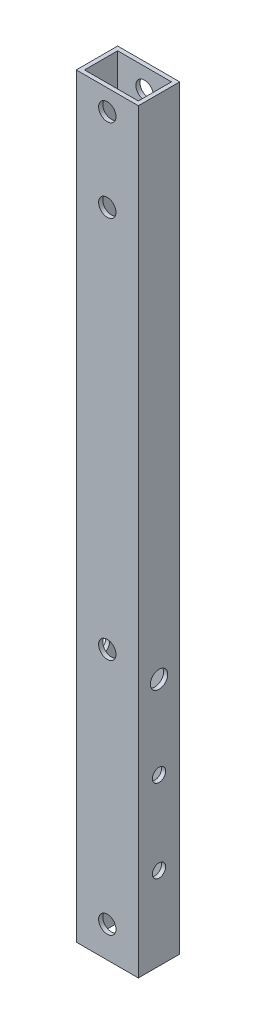
ISO-10303-21;
HEADER;
FILE_DESCRIPTION(('STEP AP214'),'2;1');
FILE_NAME('part.step','',(''),(''),'','','');
FILE_SCHEMA(('AUTOMOTIVE_DESIGN { 1 0 10303 214 1 1 1 1 }'));
ENDSEC;
DATA;
#1=APPLICATION_CONTEXT('core data for automotive mechanical design processes');
#2=APPLICATION_PROTOCOL_DEFINITION('international standard','automotive_design',2000,#1);
#3=PRODUCT_CONTEXT('',#1,'mechanical');
#4=PRODUCT('Part','Part','',(#3));
#5=PRODUCT_RELATED_PRODUCT_CATEGORY('part','',(#4));
#6=PRODUCT_DEFINITION_FORMATION('','',#4);
#7=PRODUCT_DEFINITION_CONTEXT('part definition',#1,'design');
#8=PRODUCT_DEFINITION('design','',#6,#7);
#9=PRODUCT_DEFINITION_SHAPE('','',#8);
#10=(LENGTH_UNIT() NAMED_UNIT(*) SI_UNIT(.MILLI.,.METRE.));
#11=(NAMED_UNIT(*) PLANE_ANGLE_UNIT() SI_UNIT($,.RADIAN.));
#12=(NAMED_UNIT(*) SI_UNIT($,.STERADIAN.) SOLID_ANGLE_UNIT());
#13=UNCERTAINTY_MEASURE_WITH_UNIT(LENGTH_MEASURE(1.E-05),#10,'distance_accuracy_value','');
#14=(GEOMETRIC_REPRESENTATION_CONTEXT(3) GLOBAL_UNCERTAINTY_ASSIGNED_CONTEXT((#13)) GLOBAL_UNIT_ASSIGNED_CONTEXT((#10,
#11,#12)) REPRESENTATION_CONTEXT('',''));
#15=CARTESIAN_POINT('',(0.,0.,0.));
#16=DIRECTION('',(0.,0.,1.));
#17=DIRECTION('',(1.,0.,0.));
#18=AXIS2_PLACEMENT_3D('',#15,#16,#17);
#19=CARTESIAN_POINT('',(0.,182.5,0.));
#20=DIRECTION('',(0.,1.,0.));
#21=DIRECTION('',(0.,0.,1.));
#22=AXIS2_PLACEMENT_3D('',#19,#20,#21);
#23=PLANE('',#22);
#24=DIRECTION('',(0.,0.,-1.));
#25=VECTOR('',#24,1.);
#26=CARTESIAN_POINT('',(7.50000000000001,182.5,-5.));
#27=LINE('',#26,#25);
#28=CARTESIAN_POINT('',(7.50000000000001,182.5,5.));
#29=VERTEX_POINT('',#28);
#30=CARTESIAN_POINT('',(7.50000000000001,182.5,-5.));
#31=VERTEX_POINT('',#30);
#32=EDGE_CURVE('E164',#29,#31,#27,.T.);
#33=ORIENTED_EDGE('',*,*,#32,.T.);
#34=DIRECTION('',(-1.,0.,0.));
#35=VECTOR('',#34,1.);
#36=CARTESIAN_POINT('',(-7.49999999999999,182.5,-5.));
#37=LINE('',#36,#35);
#38=CARTESIAN_POINT('',(-7.49999999999999,182.5,-5.));
#39=VERTEX_POINT('',#38);
#40=EDGE_CURVE('E167',#31,#39,#37,.T.);
#41=ORIENTED_EDGE('',*,*,#40,.T.);
#42=DIRECTION('',(0.,0.,1.));
#43=VECTOR('',#42,1.);
#44=CARTESIAN_POINT('',(-7.49999999999999,182.5,-5.));
#45=LINE('',#44,#43);
#46=CARTESIAN_POINT('',(-7.49999999999999,182.5,5.));
#47=VERTEX_POINT('',#46);
#48=EDGE_CURVE('E170',#39,#47,#45,.T.);
#49=ORIENTED_EDGE('',*,*,#48,.T.);
#50=DIRECTION('',(1.,0.,0.));
#51=VECTOR('',#50,1.);
#52=CARTESIAN_POINT('',(-7.49999999999999,182.5,5.));
#53=LINE('',#52,#51);
#54=EDGE_CURVE('E172',#47,#29,#53,.T.);
#55=ORIENTED_EDGE('',*,*,#54,.T.);
#56=EDGE_LOOP('',(#33,#41,#49,#55));
#57=FACE_BOUND('',#56,.T.);
#58=DIRECTION('',(-1.,0.,0.));
#59=VECTOR('',#58,1.);
#60=CARTESIAN_POINT('',(-7.49999999999999,182.5,-4.));
#61=LINE('',#60,#59);
#62=CARTESIAN_POINT('',(6.50000000000001,182.5,-4.));
#63=VERTEX_POINT('',#62);
#64=CARTESIAN_POINT('',(-6.49999999999999,182.5,-4.));
#65=VERTEX_POINT('',#64);
#66=EDGE_CURVE('E134',#63,#65,#61,.T.);
#67=ORIENTED_EDGE('',*,*,#66,.F.);
#68=DIRECTION('',(0.,0.,-1.));
#69=VECTOR('',#68,1.);
#70=CARTESIAN_POINT('',(6.50000000000001,182.5,-5.));
#71=LINE('',#70,#69);
#72=CARTESIAN_POINT('',(6.50000000000001,182.5,4.));
#73=VERTEX_POINT('',#72);
#74=EDGE_CURVE('E126',#73,#63,#71,.T.);
#75=ORIENTED_EDGE('',*,*,#74,.F.);
#76=DIRECTION('',(1.,0.,0.));
#77=VECTOR('',#76,1.);
#78=CARTESIAN_POINT('',(-7.49999999999999,182.5,4.));
#79=LINE('',#78,#77);
#80=CARTESIAN_POINT('',(-6.49999999999999,182.5,4.));
#81=VERTEX_POINT('',#80);
#82=EDGE_CURVE('E148',#81,#73,#79,.T.);
#83=ORIENTED_EDGE('',*,*,#82,.F.);
#84=DIRECTION('',(0.,0.,1.));
#85=VECTOR('',#84,1.);
#86=CARTESIAN_POINT('',(-6.49999999999999,182.5,-5.));
#87=LINE('',#86,#85);
#88=EDGE_CURVE('E146',#65,#81,#87,.T.);
#89=ORIENTED_EDGE('',*,*,#88,.F.);
#90=EDGE_LOOP('',(#67,#75,#83,#89));
#91=FACE_BOUND('',#90,.T.);
#92=ADVANCED_FACE('F59',(#57,#91),#23,.T.);
#93=CARTESIAN_POINT('',(0.,0.,0.));
#94=DIRECTION('',(0.,1.,0.));
#95=DIRECTION('',(0.,0.,1.));
#96=AXIS2_PLACEMENT_3D('',#93,#94,#95);
#97=PLANE('',#96);
#98=DIRECTION('',(0.,0.,-1.));
#99=VECTOR('',#98,1.);
#100=CARTESIAN_POINT('',(7.50000000000001,0.,-5.));
#101=LINE('',#100,#99);
#102=CARTESIAN_POINT('',(7.50000000000001,0.,5.));
#103=VERTEX_POINT('',#102);
#104=CARTESIAN_POINT('',(7.50000000000001,0.,-5.));
#105=VERTEX_POINT('',#104);
#106=EDGE_CURVE('E142',#103,#105,#101,.T.);
#107=ORIENTED_EDGE('',*,*,#106,.F.);
#108=DIRECTION('',(1.,0.,0.));
#109=VECTOR('',#108,1.);
#110=CARTESIAN_POINT('',(-7.49999999999999,0.,5.));
#111=LINE('',#110,#109);
#112=CARTESIAN_POINT('',(-7.49999999999999,0.,5.));
#113=VERTEX_POINT('',#112);
#114=EDGE_CURVE('E168',#113,#103,#111,.T.);
#115=ORIENTED_EDGE('',*,*,#114,.F.);
#116=DIRECTION('',(0.,0.,1.));
#117=VECTOR('',#116,1.);
#118=CARTESIAN_POINT('',(-7.49999999999999,0.,-5.));
#119=LINE('',#118,#117);
#120=CARTESIAN_POINT('',(-7.49999999999999,0.,-5.));
#121=VERTEX_POINT('',#120);
#122=EDGE_CURVE('E179',#121,#113,#119,.T.);
#123=ORIENTED_EDGE('',*,*,#122,.F.);
#124=DIRECTION('',(-1.,0.,0.));
#125=VECTOR('',#124,1.);
#126=CARTESIAN_POINT('',(-7.49999999999999,0.,-5.));
#127=LINE('',#126,#125);
#128=EDGE_CURVE('E177',#105,#121,#127,.T.);
#129=ORIENTED_EDGE('',*,*,#128,.F.);
#130=EDGE_LOOP('',(#107,#115,#123,#129));
#131=FACE_BOUND('',#130,.T.);
#132=DIRECTION('',(0.,0.,-1.));
#133=VECTOR('',#132,1.);
#134=CARTESIAN_POINT('',(6.50000000000001,0.,-5.));
#135=LINE('',#134,#133);
#136=CARTESIAN_POINT('',(6.50000000000001,0.,4.));
#137=VERTEX_POINT('',#136);
#138=CARTESIAN_POINT('',(6.50000000000001,0.,-4.));
#139=VERTEX_POINT('',#138);
#140=EDGE_CURVE('E84',#137,#139,#135,.T.);
#141=ORIENTED_EDGE('',*,*,#140,.T.);
#142=DIRECTION('',(-1.,0.,0.));
#143=VECTOR('',#142,1.);
#144=CARTESIAN_POINT('',(-7.49999999999999,0.,-4.));
#145=LINE('',#144,#143);
#146=CARTESIAN_POINT('',(-6.49999999999999,0.,-4.));
#147=VERTEX_POINT('',#146);
#148=EDGE_CURVE('E141',#139,#147,#145,.T.);
#149=ORIENTED_EDGE('',*,*,#148,.T.);
#150=DIRECTION('',(0.,0.,1.));
#151=VECTOR('',#150,1.);
#152=CARTESIAN_POINT('',(-6.49999999999999,0.,-5.));
#153=LINE('',#152,#151);
#154=CARTESIAN_POINT('',(-6.49999999999999,0.,4.));
#155=VERTEX_POINT('',#154);
#156=EDGE_CURVE('E156',#147,#155,#153,.T.);
#157=ORIENTED_EDGE('',*,*,#156,.T.);
#158=DIRECTION('',(1.,0.,0.));
#159=VECTOR('',#158,1.);
#160=CARTESIAN_POINT('',(-7.49999999999999,0.,4.));
#161=LINE('',#160,#159);
#162=EDGE_CURVE('E135',#155,#137,#161,.T.);
#163=ORIENTED_EDGE('',*,*,#162,.T.);
#164=EDGE_LOOP('',(#141,#149,#157,#163));
#165=FACE_BOUND('',#164,.T.);
#166=ADVANCED_FACE('F294',(#131,#165),#97,.F.);
#167=CARTESIAN_POINT('',(7.50000000000001,182.5,-5.));
#168=DIRECTION('',(-1.,0.,0.));
#169=DIRECTION('',(0.,0.,1.));
#170=AXIS2_PLACEMENT_3D('',#167,#168,#169);
#171=PLANE('',#170);
#172=CARTESIAN_POINT('',(7.50000000000001,20.,0.));
#173=DIRECTION('',(1.,0.,0.));
#174=DIRECTION('',(0.,0.,-1.));
#175=AXIS2_PLACEMENT_3D('',#172,#173,#174);
#176=CIRCLE('',#175,1.6);
#177=CARTESIAN_POINT('',(7.50000000000001,20.,-1.6));
#178=VERTEX_POINT('',#177);
#179=EDGE_CURVE('E335',#178,#178,#176,.T.);
#180=ORIENTED_EDGE('',*,*,#179,.F.);
#181=EDGE_LOOP('',(#180));
#182=FACE_BOUND('',#181,.T.);
#183=CARTESIAN_POINT('',(7.50000000000001,60.,0.));
#184=DIRECTION('',(1.,0.,0.));
#185=DIRECTION('',(0.,0.,-1.));
#186=AXIS2_PLACEMENT_3D('',#183,#184,#185);
#187=CIRCLE('',#186,2.10000000000001);
#188=CARTESIAN_POINT('',(7.50000000000001,60.,-2.10000000000001));
#189=VERTEX_POINT('',#188);
#190=EDGE_CURVE('E329',#189,#189,#187,.T.);
#191=ORIENTED_EDGE('',*,*,#190,.F.);
#192=EDGE_LOOP('',(#191));
#193=FACE_BOUND('',#192,.T.);
#194=CARTESIAN_POINT('',(7.50000000000001,40.,0.));
#195=DIRECTION('',(1.,0.,0.));
#196=DIRECTION('',(0.,0.,-1.));
#197=AXIS2_PLACEMENT_3D('',#194,#195,#196);
#198=CIRCLE('',#197,1.6);
#199=CARTESIAN_POINT('',(7.50000000000001,40.,-1.6));
#200=VERTEX_POINT('',#199);
#201=EDGE_CURVE('E221',#200,#200,#198,.T.);
#202=ORIENTED_EDGE('',*,*,#201,.F.);
#203=EDGE_LOOP('',(#202));
#204=FACE_BOUND('',#203,.T.);
#205=ORIENTED_EDGE('',*,*,#106,.T.);
#206=DIRECTION('',(0.,-1.,0.));
#207=VECTOR('',#206,1.);
#208=CARTESIAN_POINT('',(7.50000000000001,182.5,-5.));
#209=LINE('',#208,#207);
#210=EDGE_CURVE('E12',#31,#105,#209,.T.);
#211=ORIENTED_EDGE('',*,*,#210,.F.);
#212=ORIENTED_EDGE('',*,*,#32,.F.);
#213=DIRECTION('',(0.,-1.,0.));
#214=VECTOR('',#213,1.);
#215=CARTESIAN_POINT('',(7.50000000000001,182.5,5.));
#216=LINE('',#215,#214);
#217=EDGE_CURVE('E174',#29,#103,#216,.T.);
#218=ORIENTED_EDGE('',*,*,#217,.T.);
#219=EDGE_LOOP('',(#205,#211,#212,#218));
#220=FACE_BOUND('',#219,.T.);
#221=ADVANCED_FACE('F61',(#182,#193,#204,#220),#171,.F.);
#222=CARTESIAN_POINT('',(-7.49999999999999,182.5,-5.));
#223=DIRECTION('',(0.,0.,1.));
#224=DIRECTION('',(1.,0.,0.));
#225=AXIS2_PLACEMENT_3D('',#222,#223,#224);
#226=PLANE('',#225);
#227=CARTESIAN_POINT('',(0.,177.5,-5.));
#228=DIRECTION('',(0.,0.,1.));
#229=DIRECTION('',(1.,0.,0.));
#230=AXIS2_PLACEMENT_3D('',#227,#228,#229);
#231=CIRCLE('',#230,2.09999999999999);
#232=CARTESIAN_POINT('',(2.09999999999999,177.5,-5.));
#233=VERTEX_POINT('',#232);
#234=EDGE_CURVE('E241',#233,#233,#231,.T.);
#235=ORIENTED_EDGE('',*,*,#234,.T.);
#236=EDGE_LOOP('',(#235));
#237=FACE_BOUND('',#236,.T.);
#238=CARTESIAN_POINT('',(0.,65.,-5.));
#239=DIRECTION('',(0.,0.,1.));
#240=DIRECTION('',(1.,0.,0.));
#241=AXIS2_PLACEMENT_3D('',#238,#239,#240);
#242=CIRCLE('',#241,2.1);
#243=CARTESIAN_POINT('',(2.10000000000001,65.,-5.));
#244=VERTEX_POINT('',#243);
#245=EDGE_CURVE('E235',#244,#244,#242,.T.);
#246=ORIENTED_EDGE('',*,*,#245,.T.);
#247=EDGE_LOOP('',(#246));
#248=FACE_BOUND('',#247,.T.);
#249=CARTESIAN_POINT('',(0.,7.50000000000001,-5.));
#250=DIRECTION('',(0.,0.,1.));
#251=DIRECTION('',(1.,0.,0.));
#252=AXIS2_PLACEMENT_3D('',#249,#250,#251);
#253=CIRCLE('',#252,2.1);
#254=CARTESIAN_POINT('',(2.10000000000002,7.50000000000001,-5.));
#255=VERTEX_POINT('',#254);
#256=EDGE_CURVE('E228',#255,#255,#253,.T.);
#257=ORIENTED_EDGE('',*,*,#256,.T.);
#258=EDGE_LOOP('',(#257));
#259=FACE_BOUND('',#258,.T.);
#260=CARTESIAN_POINT('',(0.,157.5,-5.));
#261=DIRECTION('',(0.,0.,1.));
#262=DIRECTION('',(1.,0.,0.));
#263=AXIS2_PLACEMENT_3D('',#260,#261,#262);
#264=CIRCLE('',#263,2.09999999999999);
#265=CARTESIAN_POINT('',(2.1,157.5,-5.));
#266=VERTEX_POINT('',#265);
#267=EDGE_CURVE('E193',#266,#266,#264,.T.);
#268=ORIENTED_EDGE('',*,*,#267,.T.);
#269=EDGE_LOOP('',(#268));
#270=FACE_BOUND('',#269,.T.);
#271=ORIENTED_EDGE('',*,*,#128,.T.);
#272=DIRECTION('',(0.,-1.,0.));
#273=VECTOR('',#272,1.);
#274=CARTESIAN_POINT('',(-7.49999999999999,182.5,-5.));
#275=LINE('',#274,#273);
#276=EDGE_CURVE('E68',#39,#121,#275,.T.);
#277=ORIENTED_EDGE('',*,*,#276,.F.);
#278=ORIENTED_EDGE('',*,*,#40,.F.);
#279=ORIENTED_EDGE('',*,*,#210,.T.);
#280=EDGE_LOOP('',(#271,#277,#278,#279));
#281=FACE_BOUND('',#280,.T.);
#282=ADVANCED_FACE('F280',(#237,#248,#259,#270,#281),#226,.F.);
#283=CARTESIAN_POINT('',(-7.49999999999999,182.5,-5.));
#284=DIRECTION('',(1.,0.,0.));
#285=DIRECTION('',(0.,0.,-1.));
#286=AXIS2_PLACEMENT_3D('',#283,#284,#285);
#287=PLANE('',#286);
#288=CARTESIAN_POINT('',(-7.49999999999999,20.,0.));
#289=DIRECTION('',(1.,0.,0.));
#290=DIRECTION('',(0.,0.,-1.));
#291=AXIS2_PLACEMENT_3D('',#288,#289,#290);
#292=CIRCLE('',#291,1.6);
#293=CARTESIAN_POINT('',(-7.49999999999999,20.,-1.6));
#294=VERTEX_POINT('',#293);
#295=EDGE_CURVE('E208',#294,#294,#292,.T.);
#296=ORIENTED_EDGE('',*,*,#295,.T.);
#297=EDGE_LOOP('',(#296));
#298=FACE_BOUND('',#297,.T.);
#299=CARTESIAN_POINT('',(-7.49999999999999,60.,0.));
#300=DIRECTION('',(1.,0.,0.));
#301=DIRECTION('',(0.,0.,-1.));
#302=AXIS2_PLACEMENT_3D('',#299,#300,#301);
#303=CIRCLE('',#302,2.10000000000001);
#304=CARTESIAN_POINT('',(-7.49999999999999,60.,-2.10000000000001));
#305=VERTEX_POINT('',#304);
#306=EDGE_CURVE('E324',#305,#305,#303,.T.);
#307=ORIENTED_EDGE('',*,*,#306,.T.);
#308=EDGE_LOOP('',(#307));
#309=FACE_BOUND('',#308,.T.);
#310=CARTESIAN_POINT('',(-7.49999999999999,40.,0.));
#311=DIRECTION('',(1.,0.,0.));
#312=DIRECTION('',(0.,0.,-1.));
#313=AXIS2_PLACEMENT_3D('',#310,#311,#312);
#314=CIRCLE('',#313,1.6);
#315=CARTESIAN_POINT('',(-7.49999999999999,40.,-1.6));
#316=VERTEX_POINT('',#315);
#317=EDGE_CURVE('E327',#316,#316,#314,.T.);
#318=ORIENTED_EDGE('',*,*,#317,.T.);
#319=EDGE_LOOP('',(#318));
#320=FACE_BOUND('',#319,.T.);
#321=ORIENTED_EDGE('',*,*,#122,.T.);
#322=DIRECTION('',(0.,-1.,0.));
#323=VECTOR('',#322,1.);
#324=CARTESIAN_POINT('',(-7.49999999999999,182.5,5.));
#325=LINE('',#324,#323);
#326=EDGE_CURVE('E184',#47,#113,#325,.T.);
#327=ORIENTED_EDGE('',*,*,#326,.F.);
#328=ORIENTED_EDGE('',*,*,#48,.F.);
#329=ORIENTED_EDGE('',*,*,#276,.T.);
#330=EDGE_LOOP('',(#321,#327,#328,#329));
#331=FACE_BOUND('',#330,.T.);
#332=ADVANCED_FACE('F283',(#298,#309,#320,#331),#287,.F.);
#333=CARTESIAN_POINT('',(-7.49999999999999,182.5,5.));
#334=DIRECTION('',(0.,0.,-1.));
#335=DIRECTION('',(-1.,0.,0.));
#336=AXIS2_PLACEMENT_3D('',#333,#334,#335);
#337=PLANE('',#336);
#338=CARTESIAN_POINT('',(0.,177.5,5.));
#339=DIRECTION('',(0.,0.,1.));
#340=DIRECTION('',(1.,0.,0.));
#341=AXIS2_PLACEMENT_3D('',#338,#339,#340);
#342=CIRCLE('',#341,2.09999999999999);
#343=CARTESIAN_POINT('',(2.09999999999999,177.5,5.));
#344=VERTEX_POINT('',#343);
#345=EDGE_CURVE('E227',#344,#344,#342,.T.);
#346=ORIENTED_EDGE('',*,*,#345,.F.);
#347=EDGE_LOOP('',(#346));
#348=FACE_BOUND('',#347,.T.);
#349=CARTESIAN_POINT('',(0.,65.,5.));
#350=DIRECTION('',(0.,0.,1.));
#351=DIRECTION('',(1.,0.,0.));
#352=AXIS2_PLACEMENT_3D('',#349,#350,#351);
#353=CIRCLE('',#352,2.1);
#354=CARTESIAN_POINT('',(2.10000000000001,65.,5.));
#355=VERTEX_POINT('',#354);
#356=EDGE_CURVE('E238',#355,#355,#353,.T.);
#357=ORIENTED_EDGE('',*,*,#356,.F.);
#358=EDGE_LOOP('',(#357));
#359=FACE_BOUND('',#358,.T.);
#360=CARTESIAN_POINT('',(0.,7.50000000000001,5.));
#361=DIRECTION('',(0.,0.,1.));
#362=DIRECTION('',(1.,0.,0.));
#363=AXIS2_PLACEMENT_3D('',#360,#361,#362);
#364=CIRCLE('',#363,2.1);
#365=CARTESIAN_POINT('',(2.10000000000002,7.50000000000001,5.));
#366=VERTEX_POINT('',#365);
#367=EDGE_CURVE('E232',#366,#366,#364,.T.);
#368=ORIENTED_EDGE('',*,*,#367,.F.);
#369=EDGE_LOOP('',(#368));
#370=FACE_BOUND('',#369,.T.);
#371=CARTESIAN_POINT('',(0.,157.5,5.));
#372=DIRECTION('',(0.,0.,1.));
#373=DIRECTION('',(1.,0.,0.));
#374=AXIS2_PLACEMENT_3D('',#371,#372,#373);
#375=CIRCLE('',#374,2.09999999999999);
#376=CARTESIAN_POINT('',(2.1,157.5,5.));
#377=VERTEX_POINT('',#376);
#378=EDGE_CURVE('E231',#377,#377,#375,.T.);
#379=ORIENTED_EDGE('',*,*,#378,.F.);
#380=EDGE_LOOP('',(#379));
#381=FACE_BOUND('',#380,.T.);
#382=ORIENTED_EDGE('',*,*,#114,.T.);
#383=ORIENTED_EDGE('',*,*,#217,.F.);
#384=ORIENTED_EDGE('',*,*,#54,.F.);
#385=ORIENTED_EDGE('',*,*,#326,.T.);
#386=EDGE_LOOP('',(#382,#383,#384,#385));
#387=FACE_BOUND('',#386,.T.);
#388=ADVANCED_FACE('F298',(#348,#359,#370,#381,#387),#337,.F.);
#389=CARTESIAN_POINT('',(6.50000000000001,182.5,-5.));
#390=DIRECTION('',(-1.,0.,0.));
#391=DIRECTION('',(0.,0.,1.));
#392=AXIS2_PLACEMENT_3D('',#389,#390,#391);
#393=PLANE('',#392);
#394=CARTESIAN_POINT('',(6.50000000000001,20.,0.));
#395=DIRECTION('',(-1.,0.,0.));
#396=DIRECTION('',(0.,0.,1.));
#397=AXIS2_PLACEMENT_3D('',#394,#395,#396);
#398=CIRCLE('',#397,1.6);
#399=CARTESIAN_POINT('',(6.50000000000001,20.,1.6));
#400=VERTEX_POINT('',#399);
#401=EDGE_CURVE('E224',#400,#400,#398,.T.);
#402=ORIENTED_EDGE('',*,*,#401,.F.);
#403=EDGE_LOOP('',(#402));
#404=FACE_BOUND('',#403,.T.);
#405=CARTESIAN_POINT('',(6.50000000000001,60.,0.));
#406=DIRECTION('',(-1.,0.,0.));
#407=DIRECTION('',(0.,0.,1.));
#408=AXIS2_PLACEMENT_3D('',#405,#406,#407);
#409=CIRCLE('',#408,2.10000000000001);
#410=CARTESIAN_POINT('',(6.50000000000001,60.,2.10000000000001));
#411=VERTEX_POINT('',#410);
#412=EDGE_CURVE('E211',#411,#411,#409,.T.);
#413=ORIENTED_EDGE('',*,*,#412,.F.);
#414=EDGE_LOOP('',(#413));
#415=FACE_BOUND('',#414,.T.);
#416=CARTESIAN_POINT('',(6.50000000000001,40.,0.));
#417=DIRECTION('',(-1.,0.,0.));
#418=DIRECTION('',(0.,0.,1.));
#419=AXIS2_PLACEMENT_3D('',#416,#417,#418);
#420=CIRCLE('',#419,1.6);
#421=CARTESIAN_POINT('',(6.50000000000001,40.,1.6));
#422=VERTEX_POINT('',#421);
#423=EDGE_CURVE('E207',#422,#422,#420,.T.);
#424=ORIENTED_EDGE('',*,*,#423,.F.);
#425=EDGE_LOOP('',(#424));
#426=FACE_BOUND('',#425,.T.);
#427=ORIENTED_EDGE('',*,*,#140,.F.);
#428=DIRECTION('',(0.,-1.,0.));
#429=VECTOR('',#428,1.);
#430=CARTESIAN_POINT('',(6.50000000000001,182.5,4.));
#431=LINE('',#430,#429);
#432=EDGE_CURVE('E130',#73,#137,#431,.T.);
#433=ORIENTED_EDGE('',*,*,#432,.F.);
#434=ORIENTED_EDGE('',*,*,#74,.T.);
#435=DIRECTION('',(0.,-1.,0.));
#436=VECTOR('',#435,1.);
#437=CARTESIAN_POINT('',(6.50000000000001,182.5,-4.));
#438=LINE('',#437,#436);
#439=EDGE_CURVE('E129',#63,#139,#438,.T.);
#440=ORIENTED_EDGE('',*,*,#439,.T.);
#441=EDGE_LOOP('',(#427,#433,#434,#440));
#442=FACE_BOUND('',#441,.T.);
#443=ADVANCED_FACE('F128',(#404,#415,#426,#442),#393,.T.);
#444=CARTESIAN_POINT('',(-7.49999999999999,182.5,-4.));
#445=DIRECTION('',(0.,0.,1.));
#446=DIRECTION('',(1.,0.,0.));
#447=AXIS2_PLACEMENT_3D('',#444,#445,#446);
#448=PLANE('',#447);
#449=CARTESIAN_POINT('',(0.,177.5,-4.));
#450=DIRECTION('',(0.,0.,1.));
#451=DIRECTION('',(1.,0.,0.));
#452=AXIS2_PLACEMENT_3D('',#449,#450,#451);
#453=CIRCLE('',#452,2.09999999999999);
#454=CARTESIAN_POINT('',(2.09999999999999,177.5,-4.));
#455=VERTEX_POINT('',#454);
#456=EDGE_CURVE('E154',#455,#455,#453,.T.);
#457=ORIENTED_EDGE('',*,*,#456,.F.);
#458=EDGE_LOOP('',(#457));
#459=FACE_BOUND('',#458,.T.);
#460=CARTESIAN_POINT('',(0.,65.,-4.));
#461=DIRECTION('',(0.,0.,1.));
#462=DIRECTION('',(1.,0.,0.));
#463=AXIS2_PLACEMENT_3D('',#460,#461,#462);
#464=CIRCLE('',#463,2.1);
#465=CARTESIAN_POINT('',(2.10000000000001,65.,-4.));
#466=VERTEX_POINT('',#465);
#467=EDGE_CURVE('E201',#466,#466,#464,.T.);
#468=ORIENTED_EDGE('',*,*,#467,.F.);
#469=EDGE_LOOP('',(#468));
#470=FACE_BOUND('',#469,.T.);
#471=CARTESIAN_POINT('',(0.,7.50000000000001,-4.));
#472=DIRECTION('',(0.,0.,1.));
#473=DIRECTION('',(1.,0.,0.));
#474=AXIS2_PLACEMENT_3D('',#471,#472,#473);
#475=CIRCLE('',#474,2.1);
#476=CARTESIAN_POINT('',(2.10000000000002,7.50000000000001,-4.));
#477=VERTEX_POINT('',#476);
#478=EDGE_CURVE('E197',#477,#477,#475,.T.);
#479=ORIENTED_EDGE('',*,*,#478,.F.);
#480=EDGE_LOOP('',(#479));
#481=FACE_BOUND('',#480,.T.);
#482=CARTESIAN_POINT('',(0.,157.5,-4.));
#483=DIRECTION('',(0.,0.,1.));
#484=DIRECTION('',(1.,0.,0.));
#485=AXIS2_PLACEMENT_3D('',#482,#483,#484);
#486=CIRCLE('',#485,2.09999999999999);
#487=CARTESIAN_POINT('',(2.1,157.5,-4.));
#488=VERTEX_POINT('',#487);
#489=EDGE_CURVE('E192',#488,#488,#486,.T.);
#490=ORIENTED_EDGE('',*,*,#489,.F.);
#491=EDGE_LOOP('',(#490));
#492=FACE_BOUND('',#491,.T.);
#493=ORIENTED_EDGE('',*,*,#148,.F.);
#494=ORIENTED_EDGE('',*,*,#439,.F.);
#495=ORIENTED_EDGE('',*,*,#66,.T.);
#496=DIRECTION('',(0.,-1.,0.));
#497=VECTOR('',#496,1.);
#498=CARTESIAN_POINT('',(-6.49999999999999,182.5,-4.));
#499=LINE('',#498,#497);
#500=EDGE_CURVE('E143',#65,#147,#499,.T.);
#501=ORIENTED_EDGE('',*,*,#500,.T.);
#502=EDGE_LOOP('',(#493,#494,#495,#501));
#503=FACE_BOUND('',#502,.T.);
#504=ADVANCED_FACE('F138',(#459,#470,#481,#492,#503),#448,.T.);
#505=CARTESIAN_POINT('',(-6.49999999999999,182.5,-5.));
#506=DIRECTION('',(1.,0.,0.));
#507=DIRECTION('',(0.,0.,-1.));
#508=AXIS2_PLACEMENT_3D('',#505,#506,#507);
#509=PLANE('',#508);
#510=CARTESIAN_POINT('',(-6.49999999999999,20.,0.));
#511=DIRECTION('',(1.,0.,0.));
#512=DIRECTION('',(0.,0.,-1.));
#513=AXIS2_PLACEMENT_3D('',#510,#511,#512);
#514=CIRCLE('',#513,1.6);
#515=CARTESIAN_POINT('',(-6.49999999999999,20.,-1.6));
#516=VERTEX_POINT('',#515);
#517=EDGE_CURVE('E63',#516,#516,#514,.T.);
#518=ORIENTED_EDGE('',*,*,#517,.F.);
#519=EDGE_LOOP('',(#518));
#520=FACE_BOUND('',#519,.T.);
#521=CARTESIAN_POINT('',(-6.49999999999999,60.,0.));
#522=DIRECTION('',(1.,0.,0.));
#523=DIRECTION('',(0.,0.,-1.));
#524=AXIS2_PLACEMENT_3D('',#521,#522,#523);
#525=CIRCLE('',#524,2.10000000000001);
#526=CARTESIAN_POINT('',(-6.49999999999999,60.,-2.10000000000001));
#527=VERTEX_POINT('',#526);
#528=EDGE_CURVE('E209',#527,#527,#525,.T.);
#529=ORIENTED_EDGE('',*,*,#528,.F.);
#530=EDGE_LOOP('',(#529));
#531=FACE_BOUND('',#530,.T.);
#532=CARTESIAN_POINT('',(-6.49999999999999,40.,0.));
#533=DIRECTION('',(1.,0.,0.));
#534=DIRECTION('',(0.,0.,-1.));
#535=AXIS2_PLACEMENT_3D('',#532,#533,#534);
#536=CIRCLE('',#535,1.6);
#537=CARTESIAN_POINT('',(-6.49999999999999,40.,-1.6));
#538=VERTEX_POINT('',#537);
#539=EDGE_CURVE('E205',#538,#538,#536,.T.);
#540=ORIENTED_EDGE('',*,*,#539,.F.);
#541=EDGE_LOOP('',(#540));
#542=FACE_BOUND('',#541,.T.);
#543=ORIENTED_EDGE('',*,*,#156,.F.);
#544=ORIENTED_EDGE('',*,*,#500,.F.);
#545=ORIENTED_EDGE('',*,*,#88,.T.);
#546=DIRECTION('',(0.,-1.,0.));
#547=VECTOR('',#546,1.);
#548=CARTESIAN_POINT('',(-6.49999999999999,182.5,4.));
#549=LINE('',#548,#547);
#550=EDGE_CURVE('E76',#81,#155,#549,.T.);
#551=ORIENTED_EDGE('',*,*,#550,.T.);
#552=EDGE_LOOP('',(#543,#544,#545,#551));
#553=FACE_BOUND('',#552,.T.);
#554=ADVANCED_FACE('F263',(#520,#531,#542,#553),#509,.T.);
#555=CARTESIAN_POINT('',(-7.49999999999999,182.5,4.));
#556=DIRECTION('',(0.,0.,-1.));
#557=DIRECTION('',(-1.,0.,0.));
#558=AXIS2_PLACEMENT_3D('',#555,#556,#557);
#559=PLANE('',#558);
#560=CARTESIAN_POINT('',(0.,177.5,4.));
#561=DIRECTION('',(0.,0.,-1.));
#562=DIRECTION('',(-1.,0.,0.));
#563=AXIS2_PLACEMENT_3D('',#560,#561,#562);
#564=CIRCLE('',#563,2.09999999999999);
#565=CARTESIAN_POINT('',(-2.09999999999999,177.5,4.));
#566=VERTEX_POINT('',#565);
#567=EDGE_CURVE('E202',#566,#566,#564,.T.);
#568=ORIENTED_EDGE('',*,*,#567,.F.);
#569=EDGE_LOOP('',(#568));
#570=FACE_BOUND('',#569,.T.);
#571=CARTESIAN_POINT('',(0.,65.,4.));
#572=DIRECTION('',(0.,0.,-1.));
#573=DIRECTION('',(-1.,0.,0.));
#574=AXIS2_PLACEMENT_3D('',#571,#572,#573);
#575=CIRCLE('',#574,2.1);
#576=CARTESIAN_POINT('',(-2.09999999999999,65.,4.));
#577=VERTEX_POINT('',#576);
#578=EDGE_CURVE('E198',#577,#577,#575,.T.);
#579=ORIENTED_EDGE('',*,*,#578,.F.);
#580=EDGE_LOOP('',(#579));
#581=FACE_BOUND('',#580,.T.);
#582=CARTESIAN_POINT('',(0.,7.50000000000001,4.));
#583=DIRECTION('',(0.,0.,-1.));
#584=DIRECTION('',(-1.,0.,0.));
#585=AXIS2_PLACEMENT_3D('',#582,#583,#584);
#586=CIRCLE('',#585,2.1);
#587=CARTESIAN_POINT('',(-2.09999999999999,7.50000000000001,4.));
#588=VERTEX_POINT('',#587);
#589=EDGE_CURVE('E194',#588,#588,#586,.T.);
#590=ORIENTED_EDGE('',*,*,#589,.F.);
#591=EDGE_LOOP('',(#590));
#592=FACE_BOUND('',#591,.T.);
#593=CARTESIAN_POINT('',(0.,157.5,4.));
#594=DIRECTION('',(0.,0.,-1.));
#595=DIRECTION('',(-1.,0.,0.));
#596=AXIS2_PLACEMENT_3D('',#593,#594,#595);
#597=CIRCLE('',#596,2.09999999999999);
#598=CARTESIAN_POINT('',(-2.09999999999999,157.5,4.));
#599=VERTEX_POINT('',#598);
#600=EDGE_CURVE('E189',#599,#599,#597,.T.);
#601=ORIENTED_EDGE('',*,*,#600,.F.);
#602=EDGE_LOOP('',(#601));
#603=FACE_BOUND('',#602,.T.);
#604=ORIENTED_EDGE('',*,*,#162,.F.);
#605=ORIENTED_EDGE('',*,*,#550,.F.);
#606=ORIENTED_EDGE('',*,*,#82,.T.);
#607=ORIENTED_EDGE('',*,*,#432,.T.);
#608=EDGE_LOOP('',(#604,#605,#606,#607));
#609=FACE_BOUND('',#608,.T.);
#610=ADVANCED_FACE('F376',(#570,#581,#592,#603,#609),#559,.T.);
#611=CARTESIAN_POINT('',(0.,157.5,-5.));
#612=DIRECTION('',(0.,0.,1.));
#613=DIRECTION('',(1.,0.,0.));
#614=AXIS2_PLACEMENT_3D('',#611,#612,#613);
#615=CYLINDRICAL_SURFACE('',#614,2.09999999999999);
#616=ORIENTED_EDGE('',*,*,#600,.T.);
#617=EDGE_LOOP('',(#616));
#618=FACE_BOUND('',#617,.T.);
#619=ORIENTED_EDGE('',*,*,#378,.T.);
#620=EDGE_LOOP('',(#619));
#621=FACE_BOUND('',#620,.T.);
#622=ADVANCED_FACE('F277',(#618,#621),#615,.F.);
#623=CARTESIAN_POINT('',(0.,7.50000000000001,-5.));
#624=DIRECTION('',(0.,0.,1.));
#625=DIRECTION('',(1.,0.,0.));
#626=AXIS2_PLACEMENT_3D('',#623,#624,#625);
#627=CYLINDRICAL_SURFACE('',#626,2.1);
#628=ORIENTED_EDGE('',*,*,#589,.T.);
#629=EDGE_LOOP('',(#628));
#630=FACE_BOUND('',#629,.T.);
#631=ORIENTED_EDGE('',*,*,#367,.T.);
#632=EDGE_LOOP('',(#631));
#633=FACE_BOUND('',#632,.T.);
#634=ADVANCED_FACE('F386',(#630,#633),#627,.F.);
#635=CARTESIAN_POINT('',(0.,65.,-5.));
#636=DIRECTION('',(0.,0.,1.));
#637=DIRECTION('',(1.,0.,0.));
#638=AXIS2_PLACEMENT_3D('',#635,#636,#637);
#639=CYLINDRICAL_SURFACE('',#638,2.1);
#640=ORIENTED_EDGE('',*,*,#578,.T.);
#641=EDGE_LOOP('',(#640));
#642=FACE_BOUND('',#641,.T.);
#643=ORIENTED_EDGE('',*,*,#356,.T.);
#644=EDGE_LOOP('',(#643));
#645=FACE_BOUND('',#644,.T.);
#646=ADVANCED_FACE('F392',(#642,#645),#639,.F.);
#647=CARTESIAN_POINT('',(0.,177.5,-5.));
#648=DIRECTION('',(0.,0.,1.));
#649=DIRECTION('',(1.,0.,0.));
#650=AXIS2_PLACEMENT_3D('',#647,#648,#649);
#651=CYLINDRICAL_SURFACE('',#650,2.09999999999999);
#652=ORIENTED_EDGE('',*,*,#567,.T.);
#653=EDGE_LOOP('',(#652));
#654=FACE_BOUND('',#653,.T.);
#655=ORIENTED_EDGE('',*,*,#345,.T.);
#656=EDGE_LOOP('',(#655));
#657=FACE_BOUND('',#656,.T.);
#658=ADVANCED_FACE('F275',(#654,#657),#651,.F.);
#659=ORIENTED_EDGE('',*,*,#489,.T.);
#660=EDGE_LOOP('',(#659));
#661=FACE_BOUND('',#660,.T.);
#662=ORIENTED_EDGE('',*,*,#267,.F.);
#663=EDGE_LOOP('',(#662));
#664=FACE_BOUND('',#663,.T.);
#665=ADVANCED_FACE('F271',(#661,#664),#615,.F.);
#666=ORIENTED_EDGE('',*,*,#478,.T.);
#667=EDGE_LOOP('',(#666));
#668=FACE_BOUND('',#667,.T.);
#669=ORIENTED_EDGE('',*,*,#256,.F.);
#670=EDGE_LOOP('',(#669));
#671=FACE_BOUND('',#670,.T.);
#672=ADVANCED_FACE('F274',(#668,#671),#627,.F.);
#673=ORIENTED_EDGE('',*,*,#467,.T.);
#674=EDGE_LOOP('',(#673));
#675=FACE_BOUND('',#674,.T.);
#676=ORIENTED_EDGE('',*,*,#245,.F.);
#677=EDGE_LOOP('',(#676));
#678=FACE_BOUND('',#677,.T.);
#679=ADVANCED_FACE('F370',(#675,#678),#639,.F.);
#680=ORIENTED_EDGE('',*,*,#456,.T.);
#681=EDGE_LOOP('',(#680));
#682=FACE_BOUND('',#681,.T.);
#683=ORIENTED_EDGE('',*,*,#234,.F.);
#684=EDGE_LOOP('',(#683));
#685=FACE_BOUND('',#684,.T.);
#686=ADVANCED_FACE('F258',(#682,#685),#651,.F.);
#687=CARTESIAN_POINT('',(-7.49999999999999,40.,0.));
#688=DIRECTION('',(1.,0.,0.));
#689=DIRECTION('',(0.,0.,-1.));
#690=AXIS2_PLACEMENT_3D('',#687,#688,#689);
#691=CYLINDRICAL_SURFACE('',#690,1.6);
#692=ORIENTED_EDGE('',*,*,#539,.T.);
#693=EDGE_LOOP('',(#692));
#694=FACE_BOUND('',#693,.T.);
#695=ORIENTED_EDGE('',*,*,#317,.F.);
#696=EDGE_LOOP('',(#695));
#697=FACE_BOUND('',#696,.T.);
#698=ADVANCED_FACE('F353',(#694,#697),#691,.F.);
#699=CARTESIAN_POINT('',(-7.49999999999999,60.,0.));
#700=DIRECTION('',(1.,0.,0.));
#701=DIRECTION('',(0.,0.,-1.));
#702=AXIS2_PLACEMENT_3D('',#699,#700,#701);
#703=CYLINDRICAL_SURFACE('',#702,2.10000000000001);
#704=ORIENTED_EDGE('',*,*,#528,.T.);
#705=EDGE_LOOP('',(#704));
#706=FACE_BOUND('',#705,.T.);
#707=ORIENTED_EDGE('',*,*,#306,.F.);
#708=EDGE_LOOP('',(#707));
#709=FACE_BOUND('',#708,.T.);
#710=ADVANCED_FACE('F360',(#706,#709),#703,.F.);
#711=CARTESIAN_POINT('',(-7.49999999999999,20.,0.));
#712=DIRECTION('',(1.,0.,0.));
#713=DIRECTION('',(0.,0.,-1.));
#714=AXIS2_PLACEMENT_3D('',#711,#712,#713);
#715=CYLINDRICAL_SURFACE('',#714,1.6);
#716=ORIENTED_EDGE('',*,*,#517,.T.);
#717=EDGE_LOOP('',(#716));
#718=FACE_BOUND('',#717,.T.);
#719=ORIENTED_EDGE('',*,*,#295,.F.);
#720=EDGE_LOOP('',(#719));
#721=FACE_BOUND('',#720,.T.);
#722=ADVANCED_FACE('F351',(#718,#721),#715,.F.);
#723=ORIENTED_EDGE('',*,*,#423,.T.);
#724=EDGE_LOOP('',(#723));
#725=FACE_BOUND('',#724,.T.);
#726=ORIENTED_EDGE('',*,*,#201,.T.);
#727=EDGE_LOOP('',(#726));
#728=FACE_BOUND('',#727,.T.);
#729=ADVANCED_FACE('F348',(#725,#728),#691,.F.);
#730=ORIENTED_EDGE('',*,*,#412,.T.);
#731=EDGE_LOOP('',(#730));
#732=FACE_BOUND('',#731,.T.);
#733=ORIENTED_EDGE('',*,*,#190,.T.);
#734=EDGE_LOOP('',(#733));
#735=FACE_BOUND('',#734,.T.);
#736=ADVANCED_FACE('F350',(#732,#735),#703,.F.);
#737=ORIENTED_EDGE('',*,*,#401,.T.);
#738=EDGE_LOOP('',(#737));
#739=FACE_BOUND('',#738,.T.);
#740=ORIENTED_EDGE('',*,*,#179,.T.);
#741=EDGE_LOOP('',(#740));
#742=FACE_BOUND('',#741,.T.);
#743=ADVANCED_FACE('F340',(#739,#742),#715,.F.);
#744=CLOSED_SHELL('',(#92,#166,#221,#282,#332,#388,#443,#504,#554,#610,#622,#634,#646,#658,#665,
#672,#679,#686,#698,#710,#722,#729,#736,#743));
#745=MANIFOLD_SOLID_BREP('B2',#744);
#746=ADVANCED_BREP_SHAPE_REPRESENTATION('',(#18,#745),#14);
#747=SHAPE_DEFINITION_REPRESENTATION(#9,#746);
ENDSEC;
END-ISO-10303-21;
